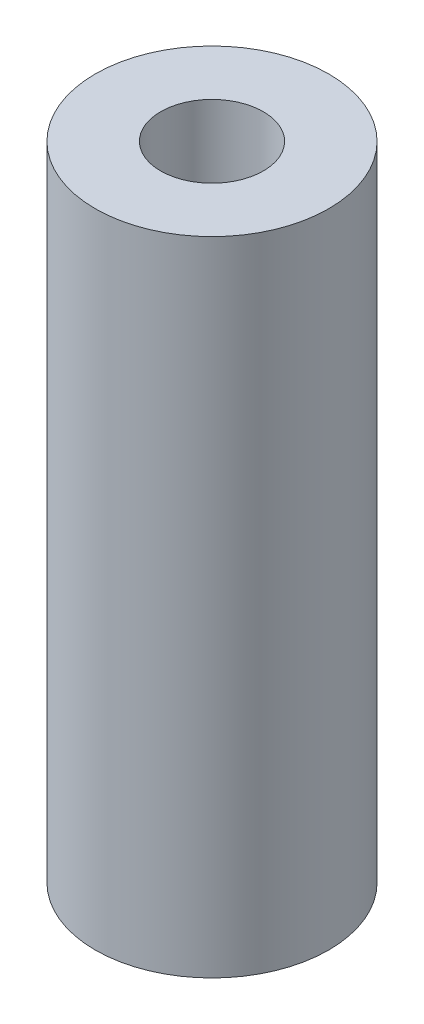
ISO-10303-21;
HEADER;
FILE_DESCRIPTION(('STEP AP214'),'2;1');
FILE_NAME('part.step','',(''),(''),'','','');
FILE_SCHEMA(('AUTOMOTIVE_DESIGN { 1 0 10303 214 1 1 1 1 }'));
ENDSEC;
DATA;
#1=APPLICATION_CONTEXT('core data for automotive mechanical design processes');
#2=APPLICATION_PROTOCOL_DEFINITION('international standard','automotive_design',2000,#1);
#3=PRODUCT_CONTEXT('',#1,'mechanical');
#4=PRODUCT('Part','Part','',(#3));
#5=PRODUCT_RELATED_PRODUCT_CATEGORY('part','',(#4));
#6=PRODUCT_DEFINITION_FORMATION('','',#4);
#7=PRODUCT_DEFINITION_CONTEXT('part definition',#1,'design');
#8=PRODUCT_DEFINITION('design','',#6,#7);
#9=PRODUCT_DEFINITION_SHAPE('','',#8);
#10=(LENGTH_UNIT() NAMED_UNIT(*) SI_UNIT(.MILLI.,.METRE.));
#11=(NAMED_UNIT(*) PLANE_ANGLE_UNIT() SI_UNIT($,.RADIAN.));
#12=(NAMED_UNIT(*) SI_UNIT($,.STERADIAN.) SOLID_ANGLE_UNIT());
#13=UNCERTAINTY_MEASURE_WITH_UNIT(LENGTH_MEASURE(1.E-05),#10,'distance_accuracy_value','');
#14=(GEOMETRIC_REPRESENTATION_CONTEXT(3) GLOBAL_UNCERTAINTY_ASSIGNED_CONTEXT((#13)) GLOBAL_UNIT_ASSIGNED_CONTEXT((#10,
#11,#12)) REPRESENTATION_CONTEXT('',''));
#15=CARTESIAN_POINT('',(0.,0.,0.));
#16=DIRECTION('',(0.,0.,1.));
#17=DIRECTION('',(1.,0.,0.));
#18=AXIS2_PLACEMENT_3D('',#15,#16,#17);
#19=CARTESIAN_POINT('',(0.,34.925,0.));
#20=DIRECTION('',(0.,1.,0.));
#21=DIRECTION('',(0.,0.,1.));
#22=AXIS2_PLACEMENT_3D('',#19,#20,#21);
#23=PLANE('',#22);
#24=CARTESIAN_POINT('',(0.,34.925,0.));
#25=DIRECTION('',(0.,1.,0.));
#26=DIRECTION('',(0.,0.,1.));
#27=AXIS2_PLACEMENT_3D('',#24,#25,#26);
#28=CIRCLE('',#27,6.35);
#29=CARTESIAN_POINT('',(0.,34.925,6.35));
#30=VERTEX_POINT('',#29);
#31=EDGE_CURVE('E10',#30,#30,#28,.T.);
#32=ORIENTED_EDGE('',*,*,#31,.T.);
#33=EDGE_LOOP('',(#32));
#34=FACE_BOUND('',#33,.T.);
#35=CARTESIAN_POINT('',(0.,34.925,0.));
#36=DIRECTION('',(0.,1.,0.));
#37=DIRECTION('',(0.,0.,1.));
#38=AXIS2_PLACEMENT_3D('',#35,#36,#37);
#39=CIRCLE('',#38,2.794);
#40=CARTESIAN_POINT('',(0.,34.925,2.794));
#41=VERTEX_POINT('',#40);
#42=EDGE_CURVE('E42',#41,#41,#39,.T.);
#43=ORIENTED_EDGE('',*,*,#42,.F.);
#44=EDGE_LOOP('',(#43));
#45=FACE_BOUND('',#44,.T.);
#46=ADVANCED_FACE('F31',(#34,#45),#23,.T.);
#47=CARTESIAN_POINT('',(0.,0.,0.));
#48=DIRECTION('',(0.,1.,0.));
#49=DIRECTION('',(0.,0.,1.));
#50=AXIS2_PLACEMENT_3D('',#47,#48,#49);
#51=PLANE('',#50);
#52=CARTESIAN_POINT('',(0.,0.,0.));
#53=DIRECTION('',(0.,1.,0.));
#54=DIRECTION('',(0.,0.,1.));
#55=AXIS2_PLACEMENT_3D('',#52,#53,#54);
#56=CIRCLE('',#55,6.35);
#57=CARTESIAN_POINT('',(0.,0.,6.35));
#58=VERTEX_POINT('',#57);
#59=EDGE_CURVE('E35',#58,#58,#56,.T.);
#60=ORIENTED_EDGE('',*,*,#59,.F.);
#61=EDGE_LOOP('',(#60));
#62=FACE_BOUND('',#61,.T.);
#63=CARTESIAN_POINT('',(0.,0.,0.));
#64=DIRECTION('',(0.,1.,0.));
#65=DIRECTION('',(0.,0.,1.));
#66=AXIS2_PLACEMENT_3D('',#63,#64,#65);
#67=CIRCLE('',#66,2.794);
#68=CARTESIAN_POINT('',(0.,0.,2.794));
#69=VERTEX_POINT('',#68);
#70=EDGE_CURVE('E44',#69,#69,#67,.T.);
#71=ORIENTED_EDGE('',*,*,#70,.T.);
#72=EDGE_LOOP('',(#71));
#73=FACE_BOUND('',#72,.T.);
#74=ADVANCED_FACE('F54',(#62,#73),#51,.F.);
#75=CARTESIAN_POINT('',(0.,34.925,0.));
#76=DIRECTION('',(0.,-1.,0.));
#77=DIRECTION('',(0.,0.,-1.));
#78=AXIS2_PLACEMENT_3D('',#75,#76,#77);
#79=CYLINDRICAL_SURFACE('',#78,6.35);
#80=ORIENTED_EDGE('',*,*,#31,.F.);
#81=EDGE_LOOP('',(#80));
#82=FACE_BOUND('',#81,.T.);
#83=ORIENTED_EDGE('',*,*,#59,.T.);
#84=EDGE_LOOP('',(#83));
#85=FACE_BOUND('',#84,.T.);
#86=ADVANCED_FACE('F33',(#82,#85),#79,.T.);
#87=CARTESIAN_POINT('',(0.,34.925,0.));
#88=DIRECTION('',(0.,-1.,0.));
#89=DIRECTION('',(0.,0.,-1.));
#90=AXIS2_PLACEMENT_3D('',#87,#88,#89);
#91=CYLINDRICAL_SURFACE('',#90,2.794);
#92=ORIENTED_EDGE('',*,*,#42,.T.);
#93=EDGE_LOOP('',(#92));
#94=FACE_BOUND('',#93,.T.);
#95=ORIENTED_EDGE('',*,*,#70,.F.);
#96=EDGE_LOOP('',(#95));
#97=FACE_BOUND('',#96,.T.);
#98=ADVANCED_FACE('F50',(#94,#97),#91,.F.);
#99=CLOSED_SHELL('',(#46,#74,#86,#98));
#100=MANIFOLD_SOLID_BREP('B2',#99);
#101=ADVANCED_BREP_SHAPE_REPRESENTATION('',(#18,#100),#14);
#102=SHAPE_DEFINITION_REPRESENTATION(#9,#101);
ENDSEC;
END-ISO-10303-21;
